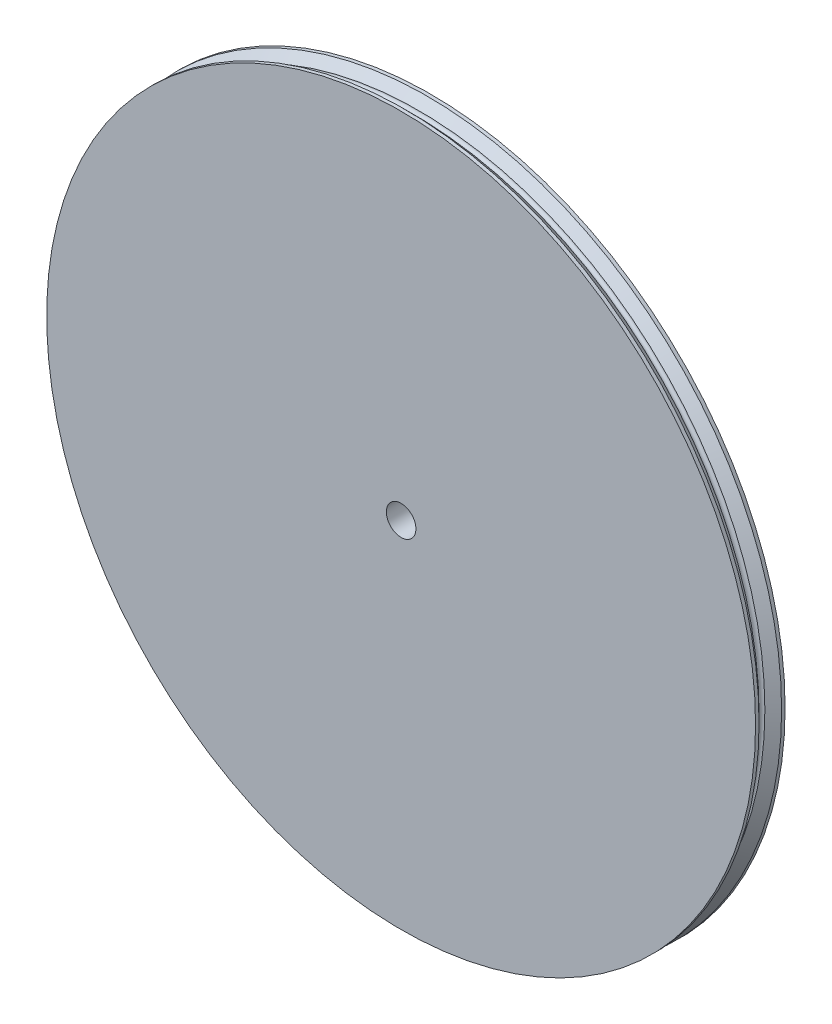
ISO-10303-21;
HEADER;
FILE_DESCRIPTION(('STEP AP214'),'2;1');
FILE_NAME('part.step','',(''),(''),'','','');
FILE_SCHEMA(('AUTOMOTIVE_DESIGN { 1 0 10303 214 1 1 1 1 }'));
ENDSEC;
DATA;
#1=APPLICATION_CONTEXT('core data for automotive mechanical design processes');
#2=APPLICATION_PROTOCOL_DEFINITION('international standard','automotive_design',2000,#1);
#3=PRODUCT_CONTEXT('',#1,'mechanical');
#4=PRODUCT('Part','Part','',(#3));
#5=PRODUCT_RELATED_PRODUCT_CATEGORY('part','',(#4));
#6=PRODUCT_DEFINITION_FORMATION('','',#4);
#7=PRODUCT_DEFINITION_CONTEXT('part definition',#1,'design');
#8=PRODUCT_DEFINITION('design','',#6,#7);
#9=PRODUCT_DEFINITION_SHAPE('','',#8);
#10=(LENGTH_UNIT() NAMED_UNIT(*) SI_UNIT(.MILLI.,.METRE.));
#11=(NAMED_UNIT(*) PLANE_ANGLE_UNIT() SI_UNIT($,.RADIAN.));
#12=(NAMED_UNIT(*) SI_UNIT($,.STERADIAN.) SOLID_ANGLE_UNIT());
#13=UNCERTAINTY_MEASURE_WITH_UNIT(LENGTH_MEASURE(1.E-05),#10,'distance_accuracy_value','');
#14=(GEOMETRIC_REPRESENTATION_CONTEXT(3) GLOBAL_UNCERTAINTY_ASSIGNED_CONTEXT((#13)) GLOBAL_UNIT_ASSIGNED_CONTEXT((#10,
#11,#12)) REPRESENTATION_CONTEXT('',''));
#15=CARTESIAN_POINT('',(0.,0.,0.));
#16=DIRECTION('',(0.,0.,1.));
#17=DIRECTION('',(1.,0.,0.));
#18=AXIS2_PLACEMENT_3D('',#15,#16,#17);
#19=CARTESIAN_POINT('',(0.,0.,6.35));
#20=DIRECTION('',(0.,0.,1.));
#21=DIRECTION('',(1.,0.,0.));
#22=AXIS2_PLACEMENT_3D('',#19,#20,#21);
#23=CYLINDRICAL_SURFACE('',#22,6.35);
#24=CARTESIAN_POINT('',(0.,0.,6.35));
#25=DIRECTION('',(0.,0.,1.));
#26=DIRECTION('',(1.,0.,0.));
#27=AXIS2_PLACEMENT_3D('',#24,#25,#26);
#28=CIRCLE('',#27,6.35);
#29=CARTESIAN_POINT('',(6.35,0.,6.35));
#30=VERTEX_POINT('',#29);
#31=EDGE_CURVE('E10',#30,#30,#28,.T.);
#32=ORIENTED_EDGE('',*,*,#31,.T.);
#33=EDGE_LOOP('',(#32));
#34=FACE_BOUND('',#33,.T.);
#35=CARTESIAN_POINT('',(0.,0.,-6.35));
#36=DIRECTION('',(0.,0.,1.));
#37=DIRECTION('',(1.,0.,0.));
#38=AXIS2_PLACEMENT_3D('',#35,#36,#37);
#39=CIRCLE('',#38,6.35);
#40=CARTESIAN_POINT('',(6.35,0.,-6.35));
#41=VERTEX_POINT('',#40);
#42=EDGE_CURVE('E58',#41,#41,#39,.T.);
#43=ORIENTED_EDGE('',*,*,#42,.F.);
#44=EDGE_LOOP('',(#43));
#45=FACE_BOUND('',#44,.T.);
#46=ADVANCED_FACE('F30',(#34,#45),#23,.F.);
#47=CARTESIAN_POINT('',(152.4,0.,6.35));
#48=DIRECTION('',(0.,0.,1.));
#49=DIRECTION('',(1.,0.,0.));
#50=AXIS2_PLACEMENT_3D('',#47,#48,#49);
#51=PLANE('',#50);
#52=CARTESIAN_POINT('',(0.,0.,6.35));
#53=DIRECTION('',(0.,0.,1.));
#54=DIRECTION('',(1.,0.,0.));
#55=AXIS2_PLACEMENT_3D('',#52,#53,#54);
#56=CIRCLE('',#55,152.4);
#57=CARTESIAN_POINT('',(152.4,0.,6.35));
#58=VERTEX_POINT('',#57);
#59=EDGE_CURVE('E36',#58,#58,#56,.T.);
#60=ORIENTED_EDGE('',*,*,#59,.T.);
#61=EDGE_LOOP('',(#60));
#62=FACE_BOUND('',#61,.T.);
#63=ORIENTED_EDGE('',*,*,#31,.F.);
#64=EDGE_LOOP('',(#63));
#65=FACE_BOUND('',#64,.T.);
#66=ADVANCED_FACE('F66',(#62,#65),#51,.T.);
#67=CARTESIAN_POINT('',(0.,0.,6.35));
#68=DIRECTION('',(0.,0.,1.));
#69=DIRECTION('',(1.,0.,0.));
#70=AXIS2_PLACEMENT_3D('',#67,#68,#69);
#71=CYLINDRICAL_SURFACE('',#70,152.4);
#72=CARTESIAN_POINT('',(0.,0.,4.85));
#73=DIRECTION('',(0.,0.,1.));
#74=DIRECTION('',(1.,0.,0.));
#75=AXIS2_PLACEMENT_3D('',#72,#73,#74);
#76=CIRCLE('',#75,152.4);
#77=CARTESIAN_POINT('',(152.4,0.,4.85));
#78=VERTEX_POINT('',#77);
#79=EDGE_CURVE('E40',#78,#78,#76,.T.);
#80=ORIENTED_EDGE('',*,*,#79,.T.);
#81=EDGE_LOOP('',(#80));
#82=FACE_BOUND('',#81,.T.);
#83=ORIENTED_EDGE('',*,*,#59,.F.);
#84=EDGE_LOOP('',(#83));
#85=FACE_BOUND('',#84,.T.);
#86=ADVANCED_FACE('F70',(#82,#85),#71,.T.);
#87=CARTESIAN_POINT('',(0.,0.,4.85));
#88=DIRECTION('',(0.,0.,1.));
#89=DIRECTION('',(1.,0.,0.));
#90=AXIS2_PLACEMENT_3D('',#87,#88,#89);
#91=CONICAL_SURFACE('',#90,152.4,0.785398163397448);
#92=CARTESIAN_POINT('',(0.,0.,1.25));
#93=DIRECTION('',(0.,0.,1.));
#94=DIRECTION('',(1.,0.,0.));
#95=AXIS2_PLACEMENT_3D('',#92,#93,#94);
#96=CIRCLE('',#95,148.8);
#97=CARTESIAN_POINT('',(148.8,0.,1.25));
#98=VERTEX_POINT('',#97);
#99=EDGE_CURVE('E44',#98,#98,#96,.T.);
#100=ORIENTED_EDGE('',*,*,#99,.T.);
#101=EDGE_LOOP('',(#100));
#102=FACE_BOUND('',#101,.T.);
#103=ORIENTED_EDGE('',*,*,#79,.F.);
#104=EDGE_LOOP('',(#103));
#105=FACE_BOUND('',#104,.T.);
#106=ADVANCED_FACE('F74',(#102,#105),#91,.T.);
#107=CARTESIAN_POINT('',(0.,0.,0.));
#108=DIRECTION('',(0.,0.,1.));
#109=DIRECTION('',(1.,0.,0.));
#110=AXIS2_PLACEMENT_3D('',#107,#108,#109);
#111=TOROIDAL_SURFACE('',#110,148.8,1.25);
#112=CARTESIAN_POINT('',(0.,0.,-1.25));
#113=DIRECTION('',(0.,0.,1.));
#114=DIRECTION('',(1.,0.,0.));
#115=AXIS2_PLACEMENT_3D('',#112,#113,#114);
#116=CIRCLE('',#115,148.8);
#117=CARTESIAN_POINT('',(148.8,0.,-1.25));
#118=VERTEX_POINT('',#117);
#119=EDGE_CURVE('E49',#118,#118,#116,.T.);
#120=ORIENTED_EDGE('',*,*,#119,.T.);
#121=EDGE_LOOP('',(#120));
#122=FACE_BOUND('',#121,.T.);
#123=ORIENTED_EDGE('',*,*,#99,.F.);
#124=EDGE_LOOP('',(#123));
#125=FACE_BOUND('',#124,.T.);
#126=ADVANCED_FACE('F81',(#122,#125),#111,.F.);
#127=CARTESIAN_POINT('',(0.,0.,-1.25));
#128=DIRECTION('',(0.,0.,-1.));
#129=DIRECTION('',(-1.,0.,0.));
#130=AXIS2_PLACEMENT_3D('',#127,#128,#129);
#131=CONICAL_SURFACE('',#130,148.8,0.785398163397448);
#132=CARTESIAN_POINT('',(0.,0.,-4.85));
#133=DIRECTION('',(0.,0.,1.));
#134=DIRECTION('',(1.,0.,0.));
#135=AXIS2_PLACEMENT_3D('',#132,#133,#134);
#136=CIRCLE('',#135,152.4);
#137=CARTESIAN_POINT('',(152.4,0.,-4.85));
#138=VERTEX_POINT('',#137);
#139=EDGE_CURVE('E52',#138,#138,#136,.T.);
#140=ORIENTED_EDGE('',*,*,#139,.T.);
#141=EDGE_LOOP('',(#140));
#142=FACE_BOUND('',#141,.T.);
#143=ORIENTED_EDGE('',*,*,#119,.F.);
#144=EDGE_LOOP('',(#143));
#145=FACE_BOUND('',#144,.T.);
#146=ADVANCED_FACE('F85',(#142,#145),#131,.T.);
#147=CARTESIAN_POINT('',(0.,0.,6.35));
#148=DIRECTION('',(0.,0.,1.));
#149=DIRECTION('',(1.,0.,0.));
#150=AXIS2_PLACEMENT_3D('',#147,#148,#149);
#151=CYLINDRICAL_SURFACE('',#150,152.4);
#152=CARTESIAN_POINT('',(0.,0.,-6.35));
#153=DIRECTION('',(0.,0.,1.));
#154=DIRECTION('',(1.,0.,0.));
#155=AXIS2_PLACEMENT_3D('',#152,#153,#154);
#156=CIRCLE('',#155,152.4);
#157=CARTESIAN_POINT('',(152.4,0.,-6.35));
#158=VERTEX_POINT('',#157);
#159=EDGE_CURVE('E55',#158,#158,#156,.T.);
#160=ORIENTED_EDGE('',*,*,#159,.T.);
#161=EDGE_LOOP('',(#160));
#162=FACE_BOUND('',#161,.T.);
#163=ORIENTED_EDGE('',*,*,#139,.F.);
#164=EDGE_LOOP('',(#163));
#165=FACE_BOUND('',#164,.T.);
#166=ADVANCED_FACE('F89',(#162,#165),#151,.T.);
#167=CARTESIAN_POINT('',(6.35,0.,-6.35));
#168=DIRECTION('',(0.,0.,-1.));
#169=DIRECTION('',(-1.,0.,0.));
#170=AXIS2_PLACEMENT_3D('',#167,#168,#169);
#171=PLANE('',#170);
#172=ORIENTED_EDGE('',*,*,#42,.T.);
#173=EDGE_LOOP('',(#172));
#174=FACE_BOUND('',#173,.T.);
#175=ORIENTED_EDGE('',*,*,#159,.F.);
#176=EDGE_LOOP('',(#175));
#177=FACE_BOUND('',#176,.T.);
#178=ADVANCED_FACE('F62',(#174,#177),#171,.T.);
#179=CLOSED_SHELL('',(#46,#66,#86,#106,#126,#146,#166,#178));
#180=MANIFOLD_SOLID_BREP('B2',#179);
#181=ADVANCED_BREP_SHAPE_REPRESENTATION('',(#18,#180),#14);
#182=SHAPE_DEFINITION_REPRESENTATION(#9,#181);
ENDSEC;
END-ISO-10303-21;
